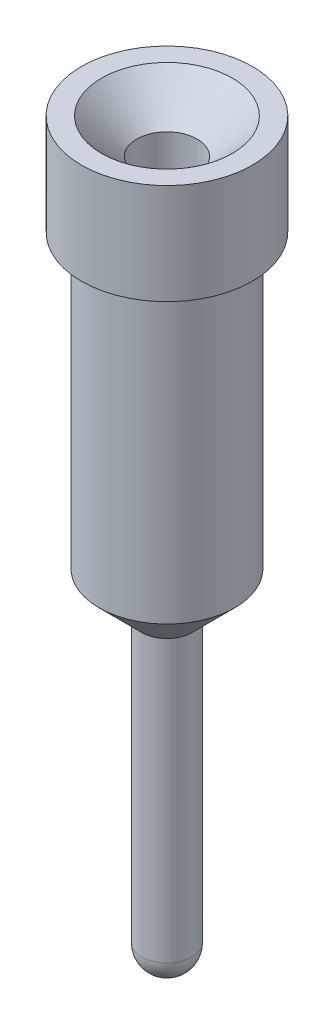
ISO-10303-21;
HEADER;
FILE_DESCRIPTION(('STEP AP214'),'2;1');
FILE_NAME('part.step','',(''),(''),'','','');
FILE_SCHEMA(('AUTOMOTIVE_DESIGN { 1 0 10303 214 1 1 1 1 }'));
ENDSEC;
DATA;
#1=APPLICATION_CONTEXT('core data for automotive mechanical design processes');
#2=APPLICATION_PROTOCOL_DEFINITION('international standard','automotive_design',2000,#1);
#3=PRODUCT_CONTEXT('',#1,'mechanical');
#4=PRODUCT('Part','Part','',(#3));
#5=PRODUCT_RELATED_PRODUCT_CATEGORY('part','',(#4));
#6=PRODUCT_DEFINITION_FORMATION('','',#4);
#7=PRODUCT_DEFINITION_CONTEXT('part definition',#1,'design');
#8=PRODUCT_DEFINITION('design','',#6,#7);
#9=PRODUCT_DEFINITION_SHAPE('','',#8);
#10=(LENGTH_UNIT() NAMED_UNIT(*) SI_UNIT(.MILLI.,.METRE.));
#11=(NAMED_UNIT(*) PLANE_ANGLE_UNIT() SI_UNIT($,.RADIAN.));
#12=(NAMED_UNIT(*) SI_UNIT($,.STERADIAN.) SOLID_ANGLE_UNIT());
#13=UNCERTAINTY_MEASURE_WITH_UNIT(LENGTH_MEASURE(1.E-05),#10,'distance_accuracy_value','');
#14=(GEOMETRIC_REPRESENTATION_CONTEXT(3) GLOBAL_UNCERTAINTY_ASSIGNED_CONTEXT((#13)) GLOBAL_UNIT_ASSIGNED_CONTEXT((#10,
#11,#12)) REPRESENTATION_CONTEXT('',''));
#15=CARTESIAN_POINT('',(0.,0.,0.));
#16=DIRECTION('',(0.,0.,1.));
#17=DIRECTION('',(1.,0.,0.));
#18=AXIS2_PLACEMENT_3D('',#15,#16,#17);
#19=CARTESIAN_POINT('',(0.,0.,0.));
#20=DIRECTION('',(0.,1.,0.));
#21=DIRECTION('',(0.,0.,1.));
#22=AXIS2_PLACEMENT_3D('',#19,#20,#21);
#23=CYLINDRICAL_SURFACE('',#22,0.85);
#24=CARTESIAN_POINT('',(0.,-1.,0.));
#25=DIRECTION('',(0.,1.,0.));
#26=DIRECTION('',(0.,0.,1.));
#27=AXIS2_PLACEMENT_3D('',#24,#25,#26);
#28=CIRCLE('',#27,0.85);
#29=CARTESIAN_POINT('',(0.,-1.,0.85));
#30=VERTEX_POINT('',#29);
#31=EDGE_CURVE('E11',#30,#30,#28,.T.);
#32=ORIENTED_EDGE('',*,*,#31,.T.);
#33=EDGE_LOOP('',(#32));
#34=FACE_BOUND('',#33,.T.);
#35=CARTESIAN_POINT('',(0.,0.,0.));
#36=DIRECTION('',(0.,1.,0.));
#37=DIRECTION('',(0.,0.,1.));
#38=AXIS2_PLACEMENT_3D('',#35,#36,#37);
#39=CIRCLE('',#38,0.85);
#40=CARTESIAN_POINT('',(0.,0.,0.85));
#41=VERTEX_POINT('',#40);
#42=EDGE_CURVE('E73',#41,#41,#39,.T.);
#43=ORIENTED_EDGE('',*,*,#42,.F.);
#44=EDGE_LOOP('',(#43));
#45=FACE_BOUND('',#44,.T.);
#46=ADVANCED_FACE('F35',(#34,#45),#23,.T.);
#47=CARTESIAN_POINT('',(-0.85,-1.,0.));
#48=DIRECTION('',(0.,-1.,0.));
#49=DIRECTION('',(0.,0.,-1.));
#50=AXIS2_PLACEMENT_3D('',#47,#48,#49);
#51=PLANE('',#50);
#52=CARTESIAN_POINT('',(0.,-1.,0.));
#53=DIRECTION('',(0.,1.,0.));
#54=DIRECTION('',(0.,0.,1.));
#55=AXIS2_PLACEMENT_3D('',#52,#53,#54);
#56=CIRCLE('',#55,0.675);
#57=CARTESIAN_POINT('',(0.,-1.,0.675));
#58=VERTEX_POINT('',#57);
#59=EDGE_CURVE('E41',#58,#58,#56,.T.);
#60=ORIENTED_EDGE('',*,*,#59,.T.);
#61=EDGE_LOOP('',(#60));
#62=FACE_BOUND('',#61,.T.);
#63=ORIENTED_EDGE('',*,*,#31,.F.);
#64=EDGE_LOOP('',(#63));
#65=FACE_BOUND('',#64,.T.);
#66=ADVANCED_FACE('F62',(#62,#65),#51,.T.);
#67=CARTESIAN_POINT('',(0.,0.,0.));
#68=DIRECTION('',(0.,1.,0.));
#69=DIRECTION('',(0.,0.,1.));
#70=AXIS2_PLACEMENT_3D('',#67,#68,#69);
#71=CYLINDRICAL_SURFACE('',#70,0.675);
#72=CARTESIAN_POINT('',(0.,-3.9,0.));
#73=DIRECTION('',(0.,1.,0.));
#74=DIRECTION('',(0.,0.,1.));
#75=AXIS2_PLACEMENT_3D('',#72,#73,#74);
#76=CIRCLE('',#75,0.675);
#77=CARTESIAN_POINT('',(0.,-3.9,0.675));
#78=VERTEX_POINT('',#77);
#79=EDGE_CURVE('E91',#78,#78,#76,.T.);
#80=ORIENTED_EDGE('',*,*,#79,.T.);
#81=EDGE_LOOP('',(#80));
#82=FACE_BOUND('',#81,.T.);
#83=ORIENTED_EDGE('',*,*,#59,.F.);
#84=EDGE_LOOP('',(#83));
#85=FACE_BOUND('',#84,.T.);
#86=ADVANCED_FACE('F67',(#82,#85),#71,.T.);
#87=CARTESIAN_POINT('',(0.,-3.9,0.));
#88=DIRECTION('',(0.,1.,0.));
#89=DIRECTION('',(0.,0.,1.));
#90=AXIS2_PLACEMENT_3D('',#87,#88,#89);
#91=CONICAL_SURFACE('',#90,0.675,0.785398163397451);
#92=CARTESIAN_POINT('',(0.,-4.325,0.));
#93=DIRECTION('',(0.,1.,0.));
#94=DIRECTION('',(0.,0.,1.));
#95=AXIS2_PLACEMENT_3D('',#92,#93,#94);
#96=CIRCLE('',#95,0.249999999999999);
#97=CARTESIAN_POINT('',(0.,-4.325,0.249999999999999));
#98=VERTEX_POINT('',#97);
#99=EDGE_CURVE('E88',#98,#98,#96,.T.);
#100=ORIENTED_EDGE('',*,*,#99,.T.);
#101=EDGE_LOOP('',(#100));
#102=FACE_BOUND('',#101,.T.);
#103=ORIENTED_EDGE('',*,*,#79,.F.);
#104=EDGE_LOOP('',(#103));
#105=FACE_BOUND('',#104,.T.);
#106=ADVANCED_FACE('F98',(#102,#105),#91,.T.);
#107=CARTESIAN_POINT('',(0.,0.,0.));
#108=DIRECTION('',(0.,1.,0.));
#109=DIRECTION('',(0.,0.,1.));
#110=AXIS2_PLACEMENT_3D('',#107,#108,#109);
#111=CYLINDRICAL_SURFACE('',#110,0.249999999999999);
#112=CARTESIAN_POINT('',(0.,-7.12,0.));
#113=DIRECTION('',(0.,1.,0.));
#114=DIRECTION('',(0.,0.,1.));
#115=AXIS2_PLACEMENT_3D('',#112,#113,#114);
#116=CIRCLE('',#115,0.249999999999999);
#117=CARTESIAN_POINT('',(0.,-7.12,0.249999999999999));
#118=VERTEX_POINT('',#117);
#119=EDGE_CURVE('E85',#118,#118,#116,.T.);
#120=ORIENTED_EDGE('',*,*,#119,.T.);
#121=EDGE_LOOP('',(#120));
#122=FACE_BOUND('',#121,.T.);
#123=ORIENTED_EDGE('',*,*,#99,.F.);
#124=EDGE_LOOP('',(#123));
#125=FACE_BOUND('',#124,.T.);
#126=ADVANCED_FACE('F57',(#122,#125),#111,.T.);
#127=CARTESIAN_POINT('',(0.,-7.12,0.));
#128=DIRECTION('',(0.,1.,0.));
#129=DIRECTION('',(-1.,0.,0.));
#130=AXIS2_PLACEMENT_3D('',#127,#128,#129);
#131=SPHERICAL_SURFACE('',#130,0.25);
#132=ORIENTED_EDGE('',*,*,#119,.F.);
#133=EDGE_LOOP('',(#132));
#134=FACE_BOUND('',#133,.T.);
#135=ADVANCED_FACE('F47',(#134),#131,.T.);
#136=CARTESIAN_POINT('',(0.,-4.,0.));
#137=DIRECTION('',(0.,1.,0.));
#138=DIRECTION('',(0.,0.,1.));
#139=AXIS2_PLACEMENT_3D('',#136,#137,#138);
#140=CONICAL_SURFACE('',#139,0.,0.785398163397448);
#141=CARTESIAN_POINT('',(0.,-3.7,0.));
#142=DIRECTION('',(0.,1.,0.));
#143=DIRECTION('',(0.,0.,1.));
#144=AXIS2_PLACEMENT_3D('',#141,#142,#143);
#145=CIRCLE('',#144,0.299999999999999);
#146=CARTESIAN_POINT('',(0.,-3.7,0.299999999999999));
#147=VERTEX_POINT('',#146);
#148=EDGE_CURVE('E83',#147,#147,#145,.T.);
#149=ORIENTED_EDGE('',*,*,#148,.T.);
#150=EDGE_LOOP('',(#149));
#151=FACE_BOUND('',#150,.T.);
#152=CARTESIAN_POINT('',(0.,-4.,0.));
#153=VERTEX_POINT('',#152);
#154=VERTEX_LOOP('',#153);
#155=FACE_BOUND('',#154,.T.);
#156=ADVANCED_FACE('F44',(#151,#155),#140,.F.);
#157=CARTESIAN_POINT('',(0.,0.,0.));
#158=DIRECTION('',(0.,1.,0.));
#159=DIRECTION('',(0.,0.,1.));
#160=AXIS2_PLACEMENT_3D('',#157,#158,#159);
#161=CYLINDRICAL_SURFACE('',#160,0.3);
#162=CARTESIAN_POINT('',(0.,-0.35,0.));
#163=DIRECTION('',(0.,1.,0.));
#164=DIRECTION('',(0.,0.,1.));
#165=AXIS2_PLACEMENT_3D('',#162,#163,#164);
#166=CIRCLE('',#165,0.3);
#167=CARTESIAN_POINT('',(0.,-0.35,0.3));
#168=VERTEX_POINT('',#167);
#169=EDGE_CURVE('E78',#168,#168,#166,.T.);
#170=ORIENTED_EDGE('',*,*,#169,.T.);
#171=EDGE_LOOP('',(#170));
#172=FACE_BOUND('',#171,.T.);
#173=ORIENTED_EDGE('',*,*,#148,.F.);
#174=EDGE_LOOP('',(#173));
#175=FACE_BOUND('',#174,.T.);
#176=ADVANCED_FACE('F46',(#172,#175),#161,.F.);
#177=CARTESIAN_POINT('',(0.,-0.35,0.));
#178=DIRECTION('',(0.,1.,0.));
#179=DIRECTION('',(0.,0.,1.));
#180=AXIS2_PLACEMENT_3D('',#177,#178,#179);
#181=CONICAL_SURFACE('',#180,0.3,0.785398163397449);
#182=CARTESIAN_POINT('',(0.,0.,0.));
#183=DIRECTION('',(0.,1.,0.));
#184=DIRECTION('',(0.,0.,1.));
#185=AXIS2_PLACEMENT_3D('',#182,#183,#184);
#186=CIRCLE('',#185,0.65);
#187=CARTESIAN_POINT('',(0.,0.,0.65));
#188=VERTEX_POINT('',#187);
#189=EDGE_CURVE('E75',#188,#188,#186,.T.);
#190=ORIENTED_EDGE('',*,*,#189,.T.);
#191=EDGE_LOOP('',(#190));
#192=FACE_BOUND('',#191,.T.);
#193=ORIENTED_EDGE('',*,*,#169,.F.);
#194=EDGE_LOOP('',(#193));
#195=FACE_BOUND('',#194,.T.);
#196=ADVANCED_FACE('F54',(#192,#195),#181,.F.);
#197=CARTESIAN_POINT('',(-0.85,0.,0.));
#198=DIRECTION('',(0.,1.,0.));
#199=DIRECTION('',(0.,0.,1.));
#200=AXIS2_PLACEMENT_3D('',#197,#198,#199);
#201=PLANE('',#200);
#202=ORIENTED_EDGE('',*,*,#42,.T.);
#203=EDGE_LOOP('',(#202));
#204=FACE_BOUND('',#203,.T.);
#205=ORIENTED_EDGE('',*,*,#189,.F.);
#206=EDGE_LOOP('',(#205));
#207=FACE_BOUND('',#206,.T.);
#208=ADVANCED_FACE('F164',(#204,#207),#201,.T.);
#209=CLOSED_SHELL('',(#46,#66,#86,#106,#126,#135,#156,#176,#196,#208));
#210=MANIFOLD_SOLID_BREP('B2',#209);
#211=ADVANCED_BREP_SHAPE_REPRESENTATION('',(#18,#210),#14);
#212=SHAPE_DEFINITION_REPRESENTATION(#9,#211);
ENDSEC;
END-ISO-10303-21;
